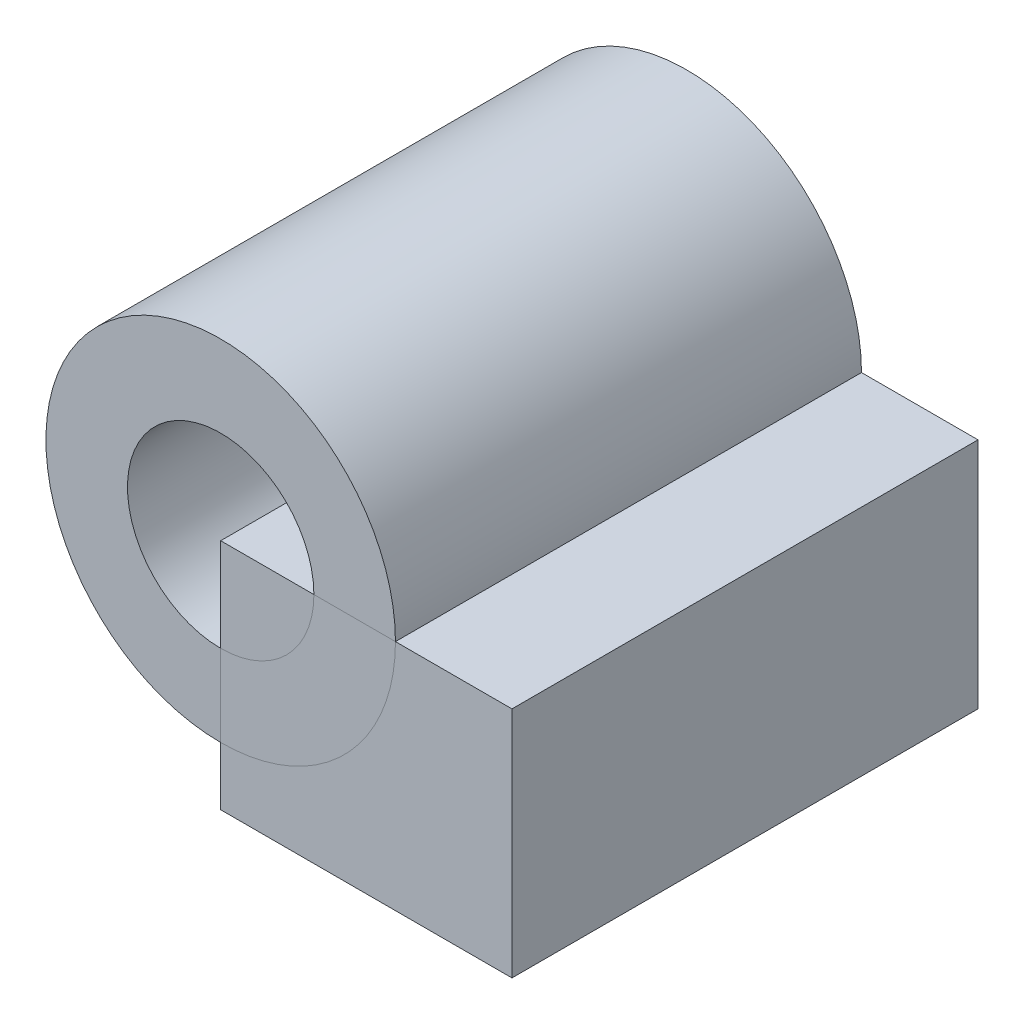
ISO-10303-21;
HEADER;
FILE_DESCRIPTION(('STEP AP214'),'2;1');
FILE_NAME('part.step','',(''),(''),'','','');
FILE_SCHEMA(('AUTOMOTIVE_DESIGN { 1 0 10303 214 1 1 1 1 }'));
ENDSEC;
DATA;
#1=APPLICATION_CONTEXT('core data for automotive mechanical design processes');
#2=APPLICATION_PROTOCOL_DEFINITION('international standard','automotive_design',2000,#1);
#3=PRODUCT_CONTEXT('',#1,'mechanical');
#4=PRODUCT('Part','Part','',(#3));
#5=PRODUCT_RELATED_PRODUCT_CATEGORY('part','',(#4));
#6=PRODUCT_DEFINITION_FORMATION('','',#4);
#7=PRODUCT_DEFINITION_CONTEXT('part definition',#1,'design');
#8=PRODUCT_DEFINITION('design','',#6,#7);
#9=PRODUCT_DEFINITION_SHAPE('','',#8);
#10=(LENGTH_UNIT() NAMED_UNIT(*) SI_UNIT(.MILLI.,.METRE.));
#11=(NAMED_UNIT(*) PLANE_ANGLE_UNIT() SI_UNIT($,.RADIAN.));
#12=(NAMED_UNIT(*) SI_UNIT($,.STERADIAN.) SOLID_ANGLE_UNIT());
#13=UNCERTAINTY_MEASURE_WITH_UNIT(LENGTH_MEASURE(1.E-05),#10,'distance_accuracy_value','');
#14=(GEOMETRIC_REPRESENTATION_CONTEXT(3) GLOBAL_UNCERTAINTY_ASSIGNED_CONTEXT((#13)) GLOBAL_UNIT_ASSIGNED_CONTEXT((#10,
#11,#12)) REPRESENTATION_CONTEXT('',''));
#15=CARTESIAN_POINT('',(0.,0.,0.));
#16=DIRECTION('',(0.,0.,1.));
#17=DIRECTION('',(1.,0.,0.));
#18=AXIS2_PLACEMENT_3D('',#15,#16,#17);
#19=CARTESIAN_POINT('',(-118.,-116.,73.));
#20=DIRECTION('',(0.,0.,1.));
#21=DIRECTION('',(1.,0.,0.));
#22=AXIS2_PLACEMENT_3D('',#19,#20,#21);
#23=PLANE('',#22);
#24=CARTESIAN_POINT('',(-118.,-116.,73.));
#25=DIRECTION('',(0.,0.,1.));
#26=DIRECTION('',(1.,0.,0.));
#27=AXIS2_PLACEMENT_3D('',#24,#25,#26);
#28=CIRCLE('',#27,6.);
#29=CARTESIAN_POINT('',(-118.,-122.,73.));
#30=VERTEX_POINT('',#29);
#31=CARTESIAN_POINT('',(-112.,-116.,73.));
#32=VERTEX_POINT('',#31);
#33=EDGE_CURVE('E20',#30,#32,#28,.T.);
#34=ORIENTED_EDGE('',*,*,#33,.T.);
#35=DIRECTION('',(1.,0.,0.));
#36=VECTOR('',#35,1.);
#37=CARTESIAN_POINT('',(-118.,-116.,73.));
#38=LINE('',#37,#36);
#39=CARTESIAN_POINT('',(-114.8,-116.,73.));
#40=VERTEX_POINT('',#39);
#41=EDGE_CURVE('E73',#40,#32,#38,.T.);
#42=ORIENTED_EDGE('',*,*,#41,.F.);
#43=CARTESIAN_POINT('',(-118.,-116.,73.));
#44=DIRECTION('',(0.,0.,1.));
#45=DIRECTION('',(1.,0.,0.));
#46=AXIS2_PLACEMENT_3D('',#43,#44,#45);
#47=CIRCLE('',#46,3.2);
#48=CARTESIAN_POINT('',(-118.,-119.2,73.));
#49=VERTEX_POINT('',#48);
#50=EDGE_CURVE('E10',#49,#40,#47,.T.);
#51=ORIENTED_EDGE('',*,*,#50,.F.);
#52=DIRECTION('',(0.,1.,0.));
#53=VECTOR('',#52,1.);
#54=CARTESIAN_POINT('',(-118.,-124.,73.));
#55=LINE('',#54,#53);
#56=EDGE_CURVE('E27',#30,#49,#55,.T.);
#57=ORIENTED_EDGE('',*,*,#56,.F.);
#58=EDGE_LOOP('',(#34,#42,#51,#57));
#59=FACE_BOUND('',#58,.T.);
#60=ADVANCED_FACE('F16',(#59),#23,.T.);
#61=CARTESIAN_POINT('',(-118.,-124.,73.));
#62=DIRECTION('',(0.,0.,1.));
#63=DIRECTION('',(1.,0.,0.));
#64=AXIS2_PLACEMENT_3D('',#61,#62,#63);
#65=PLANE('',#64);
#66=DIRECTION('',(0.,1.,0.));
#67=VECTOR('',#66,1.);
#68=CARTESIAN_POINT('',(-118.,-124.,73.));
#69=LINE('',#68,#67);
#70=CARTESIAN_POINT('',(-118.,-116.,73.));
#71=VERTEX_POINT('',#70);
#72=EDGE_CURVE('E210',#49,#71,#69,.T.);
#73=ORIENTED_EDGE('',*,*,#72,.F.);
#74=ORIENTED_EDGE('',*,*,#50,.T.);
#75=DIRECTION('',(1.,0.,0.));
#76=VECTOR('',#75,1.);
#77=CARTESIAN_POINT('',(-118.,-116.,73.));
#78=LINE('',#77,#76);
#79=EDGE_CURVE('E40',#71,#40,#78,.T.);
#80=ORIENTED_EDGE('',*,*,#79,.F.);
#81=EDGE_LOOP('',(#73,#74,#80));
#82=FACE_BOUND('',#81,.T.);
#83=ADVANCED_FACE('F284',(#82),#65,.T.);
#84=CARTESIAN_POINT('',(-118.,-116.,73.));
#85=DIRECTION('',(0.,0.,1.));
#86=DIRECTION('',(1.,0.,0.));
#87=AXIS2_PLACEMENT_3D('',#84,#85,#86);
#88=PLANE('',#87);
#89=ORIENTED_EDGE('',*,*,#41,.T.);
#90=CARTESIAN_POINT('',(-118.,-116.,73.));
#91=DIRECTION('',(0.,0.,1.));
#92=DIRECTION('',(1.,0.,0.));
#93=AXIS2_PLACEMENT_3D('',#90,#91,#92);
#94=CIRCLE('',#93,6.);
#95=EDGE_CURVE('E217',#32,#30,#94,.T.);
#96=ORIENTED_EDGE('',*,*,#95,.T.);
#97=ORIENTED_EDGE('',*,*,#56,.T.);
#98=CARTESIAN_POINT('',(-118.,-116.,73.));
#99=DIRECTION('',(0.,0.,1.));
#100=DIRECTION('',(1.,0.,0.));
#101=AXIS2_PLACEMENT_3D('',#98,#99,#100);
#102=CIRCLE('',#101,3.2);
#103=EDGE_CURVE('E222',#40,#49,#102,.T.);
#104=ORIENTED_EDGE('',*,*,#103,.F.);
#105=EDGE_LOOP('',(#89,#96,#97,#104));
#106=FACE_BOUND('',#105,.T.);
#107=ADVANCED_FACE('F290',(#106),#88,.T.);
#108=CARTESIAN_POINT('',(-118.,-124.,73.));
#109=DIRECTION('',(0.,0.,1.));
#110=DIRECTION('',(1.,0.,0.));
#111=AXIS2_PLACEMENT_3D('',#108,#109,#110);
#112=PLANE('',#111);
#113=DIRECTION('',(0.,1.,0.));
#114=VECTOR('',#113,1.);
#115=CARTESIAN_POINT('',(-118.,-124.,73.));
#116=LINE('',#115,#114);
#117=CARTESIAN_POINT('',(-118.,-124.,73.));
#118=VERTEX_POINT('',#117);
#119=EDGE_CURVE('E141',#118,#30,#116,.T.);
#120=ORIENTED_EDGE('',*,*,#119,.F.);
#121=DIRECTION('',(1.,0.,0.));
#122=VECTOR('',#121,1.);
#123=CARTESIAN_POINT('',(-118.,-124.,73.));
#124=LINE('',#123,#122);
#125=CARTESIAN_POINT('',(-108.,-124.,73.));
#126=VERTEX_POINT('',#125);
#127=EDGE_CURVE('E138',#118,#126,#124,.T.);
#128=ORIENTED_EDGE('',*,*,#127,.T.);
#129=DIRECTION('',(0.,1.,0.));
#130=VECTOR('',#129,1.);
#131=CARTESIAN_POINT('',(-108.,-124.,73.));
#132=LINE('',#131,#130);
#133=CARTESIAN_POINT('',(-108.,-116.,73.));
#134=VERTEX_POINT('',#133);
#135=EDGE_CURVE('E84',#126,#134,#132,.T.);
#136=ORIENTED_EDGE('',*,*,#135,.T.);
#137=DIRECTION('',(1.,0.,0.));
#138=VECTOR('',#137,1.);
#139=CARTESIAN_POINT('',(-118.,-116.,73.));
#140=LINE('',#139,#138);
#141=EDGE_CURVE('E186',#32,#134,#140,.T.);
#142=ORIENTED_EDGE('',*,*,#141,.F.);
#143=ORIENTED_EDGE('',*,*,#33,.F.);
#144=EDGE_LOOP('',(#120,#128,#136,#142,#143));
#145=FACE_BOUND('',#144,.T.);
#146=ADVANCED_FACE('F279',(#145),#112,.T.);
#147=CARTESIAN_POINT('',(-118.,-116.,57.));
#148=DIRECTION('',(0.,1.,0.));
#149=DIRECTION('',(1.,0.,0.));
#150=AXIS2_PLACEMENT_3D('',#147,#148,#149);
#151=PLANE('',#150);
#152=DIRECTION('',(1.,0.,0.));
#153=VECTOR('',#152,1.);
#154=CARTESIAN_POINT('',(-118.,-116.,57.));
#155=LINE('',#154,#153);
#156=CARTESIAN_POINT('',(-118.,-116.,57.));
#157=VERTEX_POINT('',#156);
#158=CARTESIAN_POINT('',(-114.8,-116.,57.));
#159=VERTEX_POINT('',#158);
#160=EDGE_CURVE('E175',#157,#159,#155,.T.);
#161=ORIENTED_EDGE('',*,*,#160,.F.);
#162=DIRECTION('',(0.,0.,1.));
#163=VECTOR('',#162,1.);
#164=CARTESIAN_POINT('',(-118.,-116.,57.));
#165=LINE('',#164,#163);
#166=EDGE_CURVE('E122',#157,#71,#165,.T.);
#167=ORIENTED_EDGE('',*,*,#166,.T.);
#168=ORIENTED_EDGE('',*,*,#79,.T.);
#169=DIRECTION('',(0.,0.,1.));
#170=VECTOR('',#169,1.);
#171=CARTESIAN_POINT('',(-114.8,-116.,57.));
#172=LINE('',#171,#170);
#173=EDGE_CURVE('E168',#159,#40,#172,.T.);
#174=ORIENTED_EDGE('',*,*,#173,.F.);
#175=EDGE_LOOP('',(#161,#167,#168,#174));
#176=FACE_BOUND('',#175,.T.);
#177=ADVANCED_FACE('F268',(#176),#151,.T.);
#178=CARTESIAN_POINT('',(-118.,-124.,57.));
#179=DIRECTION('',(1.,0.,0.));
#180=DIRECTION('',(0.,1.,0.));
#181=AXIS2_PLACEMENT_3D('',#178,#179,#180);
#182=PLANE('',#181);
#183=ORIENTED_EDGE('',*,*,#166,.F.);
#184=DIRECTION('',(0.,1.,0.));
#185=VECTOR('',#184,1.);
#186=CARTESIAN_POINT('',(-118.,-124.,57.));
#187=LINE('',#186,#185);
#188=CARTESIAN_POINT('',(-118.,-119.2,57.));
#189=VERTEX_POINT('',#188);
#190=EDGE_CURVE('E172',#189,#157,#187,.T.);
#191=ORIENTED_EDGE('',*,*,#190,.F.);
#192=DIRECTION('',(0.,0.,1.));
#193=VECTOR('',#192,1.);
#194=CARTESIAN_POINT('',(-118.,-119.2,57.));
#195=LINE('',#194,#193);
#196=EDGE_CURVE('E113',#189,#49,#195,.T.);
#197=ORIENTED_EDGE('',*,*,#196,.T.);
#198=ORIENTED_EDGE('',*,*,#72,.T.);
#199=EDGE_LOOP('',(#183,#191,#197,#198));
#200=FACE_BOUND('',#199,.T.);
#201=ADVANCED_FACE('F270',(#200),#182,.F.);
#202=CARTESIAN_POINT('',(-118.,-116.,57.));
#203=DIRECTION('',(0.,0.,1.));
#204=DIRECTION('',(1.,0.,0.));
#205=AXIS2_PLACEMENT_3D('',#202,#203,#204);
#206=CYLINDRICAL_SURFACE('',#205,6.);
#207=ORIENTED_EDGE('',*,*,#95,.F.);
#208=DIRECTION('',(0.,0.,1.));
#209=VECTOR('',#208,1.);
#210=CARTESIAN_POINT('',(-112.,-116.,57.));
#211=LINE('',#210,#209);
#212=CARTESIAN_POINT('',(-112.,-116.,57.));
#213=VERTEX_POINT('',#212);
#214=EDGE_CURVE('E192',#213,#32,#211,.T.);
#215=ORIENTED_EDGE('',*,*,#214,.F.);
#216=CARTESIAN_POINT('',(-118.,-116.,57.));
#217=DIRECTION('',(0.,0.,1.));
#218=DIRECTION('',(1.,0.,0.));
#219=AXIS2_PLACEMENT_3D('',#216,#217,#218);
#220=CIRCLE('',#219,6.);
#221=CARTESIAN_POINT('',(-118.,-122.,57.));
#222=VERTEX_POINT('',#221);
#223=EDGE_CURVE('E227',#213,#222,#220,.T.);
#224=ORIENTED_EDGE('',*,*,#223,.T.);
#225=DIRECTION('',(0.,0.,1.));
#226=VECTOR('',#225,1.);
#227=CARTESIAN_POINT('',(-118.,-122.,57.));
#228=LINE('',#227,#226);
#229=EDGE_CURVE('E103',#222,#30,#228,.T.);
#230=ORIENTED_EDGE('',*,*,#229,.T.);
#231=EDGE_LOOP('',(#207,#215,#224,#230));
#232=FACE_BOUND('',#231,.T.);
#233=ADVANCED_FACE('F260',(#232),#206,.T.);
#234=CARTESIAN_POINT('',(-118.,-116.,57.));
#235=DIRECTION('',(0.,0.,1.));
#236=DIRECTION('',(1.,0.,0.));
#237=AXIS2_PLACEMENT_3D('',#234,#235,#236);
#238=CYLINDRICAL_SURFACE('',#237,3.2);
#239=ORIENTED_EDGE('',*,*,#196,.F.);
#240=CARTESIAN_POINT('',(-118.,-116.,57.));
#241=DIRECTION('',(0.,0.,1.));
#242=DIRECTION('',(1.,0.,0.));
#243=AXIS2_PLACEMENT_3D('',#240,#241,#242);
#244=CIRCLE('',#243,3.2);
#245=EDGE_CURVE('E150',#159,#189,#244,.T.);
#246=ORIENTED_EDGE('',*,*,#245,.F.);
#247=ORIENTED_EDGE('',*,*,#173,.T.);
#248=ORIENTED_EDGE('',*,*,#103,.T.);
#249=EDGE_LOOP('',(#239,#246,#247,#248));
#250=FACE_BOUND('',#249,.T.);
#251=ADVANCED_FACE('F269',(#250),#238,.F.);
#252=CARTESIAN_POINT('',(-118.,-124.,57.));
#253=DIRECTION('',(0.,1.,0.));
#254=DIRECTION('',(1.,0.,0.));
#255=AXIS2_PLACEMENT_3D('',#252,#253,#254);
#256=PLANE('',#255);
#257=DIRECTION('',(0.,0.,1.));
#258=VECTOR('',#257,1.);
#259=CARTESIAN_POINT('',(-108.,-124.,57.));
#260=LINE('',#259,#258);
#261=CARTESIAN_POINT('',(-108.,-124.,57.));
#262=VERTEX_POINT('',#261);
#263=EDGE_CURVE('E171',#262,#126,#260,.T.);
#264=ORIENTED_EDGE('',*,*,#263,.T.);
#265=ORIENTED_EDGE('',*,*,#127,.F.);
#266=DIRECTION('',(0.,0.,1.));
#267=VECTOR('',#266,1.);
#268=CARTESIAN_POINT('',(-118.,-124.,57.));
#269=LINE('',#268,#267);
#270=CARTESIAN_POINT('',(-118.,-124.,57.));
#271=VERTEX_POINT('',#270);
#272=EDGE_CURVE('E132',#271,#118,#269,.T.);
#273=ORIENTED_EDGE('',*,*,#272,.F.);
#274=DIRECTION('',(1.,0.,0.));
#275=VECTOR('',#274,1.);
#276=CARTESIAN_POINT('',(-118.,-124.,57.));
#277=LINE('',#276,#275);
#278=EDGE_CURVE('E136',#271,#262,#277,.T.);
#279=ORIENTED_EDGE('',*,*,#278,.T.);
#280=EDGE_LOOP('',(#264,#265,#273,#279));
#281=FACE_BOUND('',#280,.T.);
#282=ADVANCED_FACE('F134',(#281),#256,.F.);
#283=CARTESIAN_POINT('',(-108.,-124.,57.));
#284=DIRECTION('',(1.,0.,0.));
#285=DIRECTION('',(0.,1.,0.));
#286=AXIS2_PLACEMENT_3D('',#283,#284,#285);
#287=PLANE('',#286);
#288=ORIENTED_EDGE('',*,*,#263,.F.);
#289=DIRECTION('',(0.,1.,0.));
#290=VECTOR('',#289,1.);
#291=CARTESIAN_POINT('',(-108.,-124.,57.));
#292=LINE('',#291,#290);
#293=CARTESIAN_POINT('',(-108.,-116.,57.));
#294=VERTEX_POINT('',#293);
#295=EDGE_CURVE('E155',#262,#294,#292,.T.);
#296=ORIENTED_EDGE('',*,*,#295,.T.);
#297=DIRECTION('',(0.,0.,1.));
#298=VECTOR('',#297,1.);
#299=CARTESIAN_POINT('',(-108.,-116.,57.));
#300=LINE('',#299,#298);
#301=EDGE_CURVE('E184',#294,#134,#300,.T.);
#302=ORIENTED_EDGE('',*,*,#301,.T.);
#303=ORIENTED_EDGE('',*,*,#135,.F.);
#304=EDGE_LOOP('',(#288,#296,#302,#303));
#305=FACE_BOUND('',#304,.T.);
#306=ADVANCED_FACE('F18',(#305),#287,.T.);
#307=CARTESIAN_POINT('',(-118.,-116.,57.));
#308=DIRECTION('',(0.,1.,0.));
#309=DIRECTION('',(1.,0.,0.));
#310=AXIS2_PLACEMENT_3D('',#307,#308,#309);
#311=PLANE('',#310);
#312=DIRECTION('',(1.,0.,0.));
#313=VECTOR('',#312,1.);
#314=CARTESIAN_POINT('',(-118.,-116.,57.));
#315=LINE('',#314,#313);
#316=EDGE_CURVE('E162',#213,#294,#315,.T.);
#317=ORIENTED_EDGE('',*,*,#316,.F.);
#318=ORIENTED_EDGE('',*,*,#214,.T.);
#319=ORIENTED_EDGE('',*,*,#141,.T.);
#320=ORIENTED_EDGE('',*,*,#301,.F.);
#321=EDGE_LOOP('',(#317,#318,#319,#320));
#322=FACE_BOUND('',#321,.T.);
#323=ADVANCED_FACE('F242',(#322),#311,.T.);
#324=CARTESIAN_POINT('',(-118.,-124.,57.));
#325=DIRECTION('',(1.,0.,0.));
#326=DIRECTION('',(0.,1.,0.));
#327=AXIS2_PLACEMENT_3D('',#324,#325,#326);
#328=PLANE('',#327);
#329=ORIENTED_EDGE('',*,*,#229,.F.);
#330=DIRECTION('',(0.,1.,0.));
#331=VECTOR('',#330,1.);
#332=CARTESIAN_POINT('',(-118.,-124.,57.));
#333=LINE('',#332,#331);
#334=EDGE_CURVE('E144',#271,#222,#333,.T.);
#335=ORIENTED_EDGE('',*,*,#334,.F.);
#336=ORIENTED_EDGE('',*,*,#272,.T.);
#337=ORIENTED_EDGE('',*,*,#119,.T.);
#338=EDGE_LOOP('',(#329,#335,#336,#337));
#339=FACE_BOUND('',#338,.T.);
#340=ADVANCED_FACE('F145',(#339),#328,.F.);
#341=CARTESIAN_POINT('',(-118.,-124.,57.));
#342=DIRECTION('',(0.,0.,1.));
#343=DIRECTION('',(1.,0.,0.));
#344=AXIS2_PLACEMENT_3D('',#341,#342,#343);
#345=PLANE('',#344);
#346=ORIENTED_EDGE('',*,*,#160,.T.);
#347=CARTESIAN_POINT('',(-118.,-116.,57.));
#348=DIRECTION('',(0.,0.,1.));
#349=DIRECTION('',(1.,0.,0.));
#350=AXIS2_PLACEMENT_3D('',#347,#348,#349);
#351=CIRCLE('',#350,3.2);
#352=EDGE_CURVE('E180',#189,#159,#351,.T.);
#353=ORIENTED_EDGE('',*,*,#352,.F.);
#354=ORIENTED_EDGE('',*,*,#190,.T.);
#355=EDGE_LOOP('',(#346,#353,#354));
#356=FACE_BOUND('',#355,.T.);
#357=ADVANCED_FACE('F266',(#356),#345,.F.);
#358=CARTESIAN_POINT('',(-118.,-116.,57.));
#359=DIRECTION('',(0.,0.,1.));
#360=DIRECTION('',(1.,0.,0.));
#361=AXIS2_PLACEMENT_3D('',#358,#359,#360);
#362=PLANE('',#361);
#363=ORIENTED_EDGE('',*,*,#245,.T.);
#364=DIRECTION('',(0.,1.,0.));
#365=VECTOR('',#364,1.);
#366=CARTESIAN_POINT('',(-118.,-124.,57.));
#367=LINE('',#366,#365);
#368=EDGE_CURVE('E176',#222,#189,#367,.T.);
#369=ORIENTED_EDGE('',*,*,#368,.F.);
#370=ORIENTED_EDGE('',*,*,#223,.F.);
#371=DIRECTION('',(1.,0.,0.));
#372=VECTOR('',#371,1.);
#373=CARTESIAN_POINT('',(-118.,-116.,57.));
#374=LINE('',#373,#372);
#375=EDGE_CURVE('E208',#159,#213,#374,.T.);
#376=ORIENTED_EDGE('',*,*,#375,.F.);
#377=EDGE_LOOP('',(#363,#369,#370,#376));
#378=FACE_BOUND('',#377,.T.);
#379=ADVANCED_FACE('F264',(#378),#362,.F.);
#380=CARTESIAN_POINT('',(-118.,-124.,57.));
#381=DIRECTION('',(0.,0.,1.));
#382=DIRECTION('',(1.,0.,0.));
#383=AXIS2_PLACEMENT_3D('',#380,#381,#382);
#384=PLANE('',#383);
#385=CARTESIAN_POINT('',(-118.,-116.,57.));
#386=DIRECTION('',(0.,0.,1.));
#387=DIRECTION('',(1.,0.,0.));
#388=AXIS2_PLACEMENT_3D('',#385,#386,#387);
#389=CIRCLE('',#388,6.);
#390=EDGE_CURVE('E190',#222,#213,#389,.T.);
#391=ORIENTED_EDGE('',*,*,#390,.T.);
#392=ORIENTED_EDGE('',*,*,#316,.T.);
#393=ORIENTED_EDGE('',*,*,#295,.F.);
#394=ORIENTED_EDGE('',*,*,#278,.F.);
#395=ORIENTED_EDGE('',*,*,#334,.T.);
#396=EDGE_LOOP('',(#391,#392,#393,#394,#395));
#397=FACE_BOUND('',#396,.T.);
#398=ADVANCED_FACE('F152',(#397),#384,.F.);
#399=CARTESIAN_POINT('',(-118.,-116.,57.));
#400=DIRECTION('',(0.,0.,1.));
#401=DIRECTION('',(1.,0.,0.));
#402=AXIS2_PLACEMENT_3D('',#399,#400,#401);
#403=PLANE('',#402);
#404=ORIENTED_EDGE('',*,*,#368,.T.);
#405=ORIENTED_EDGE('',*,*,#352,.T.);
#406=ORIENTED_EDGE('',*,*,#375,.T.);
#407=ORIENTED_EDGE('',*,*,#390,.F.);
#408=EDGE_LOOP('',(#404,#405,#406,#407));
#409=FACE_BOUND('',#408,.T.);
#410=ADVANCED_FACE('F247',(#409),#403,.F.);
#411=CLOSED_SHELL('',(#60,#83,#107,#146,#177,#201,#233,#251,#282,#306,#323,#340,#357,#379,#398,#410));
#412=MANIFOLD_SOLID_BREP('B1',#411);
#413=ADVANCED_BREP_SHAPE_REPRESENTATION('',(#18,#412),#14);
#414=SHAPE_DEFINITION_REPRESENTATION(#9,#413);
ENDSEC;
END-ISO-10303-21;
